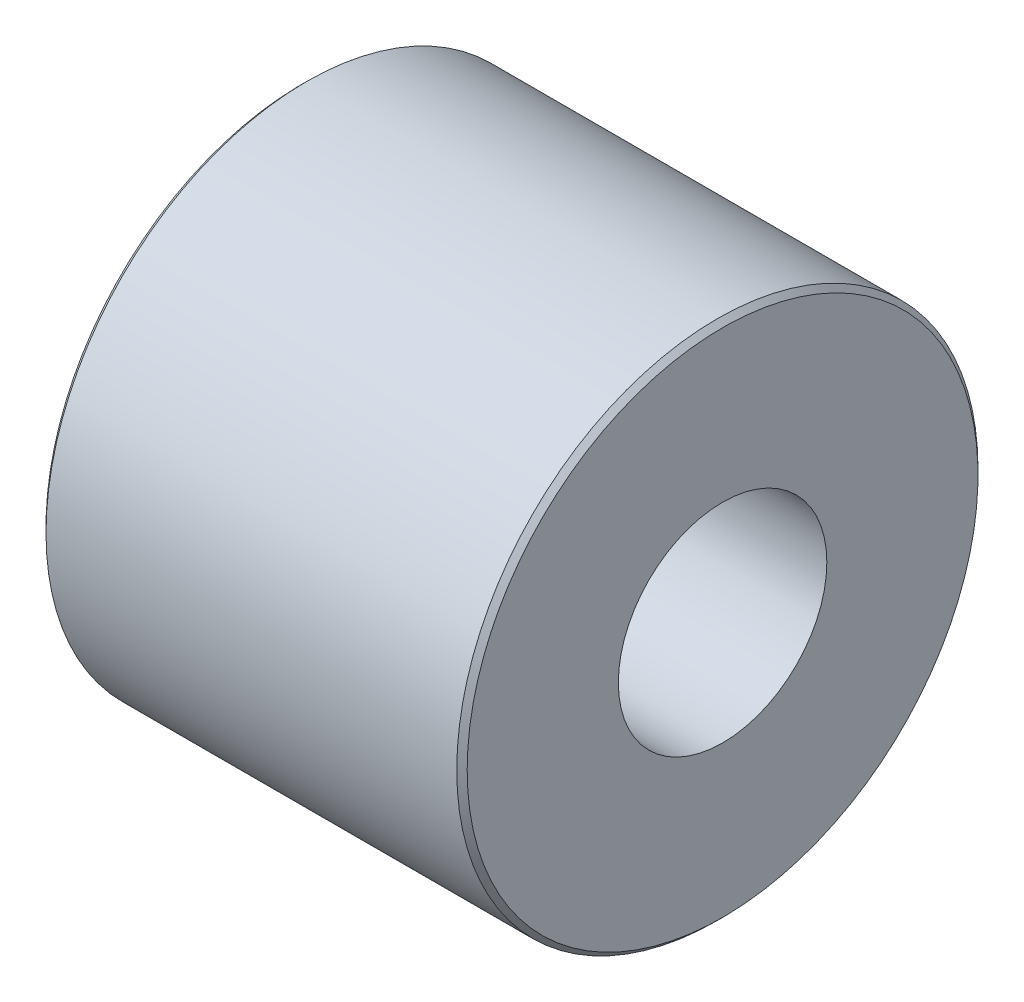
ISO-10303-21;
HEADER;
FILE_DESCRIPTION(('STEP AP214'),'2;1');
FILE_NAME('part.step','',(''),(''),'','','');
FILE_SCHEMA(('AUTOMOTIVE_DESIGN { 1 0 10303 214 1 1 1 1 }'));
ENDSEC;
DATA;
#1=APPLICATION_CONTEXT('core data for automotive mechanical design processes');
#2=APPLICATION_PROTOCOL_DEFINITION('international standard','automotive_design',2000,#1);
#3=PRODUCT_CONTEXT('',#1,'mechanical');
#4=PRODUCT('Part','Part','',(#3));
#5=PRODUCT_RELATED_PRODUCT_CATEGORY('part','',(#4));
#6=PRODUCT_DEFINITION_FORMATION('','',#4);
#7=PRODUCT_DEFINITION_CONTEXT('part definition',#1,'design');
#8=PRODUCT_DEFINITION('design','',#6,#7);
#9=PRODUCT_DEFINITION_SHAPE('','',#8);
#10=(LENGTH_UNIT() NAMED_UNIT(*) SI_UNIT(.MILLI.,.METRE.));
#11=(NAMED_UNIT(*) PLANE_ANGLE_UNIT() SI_UNIT($,.RADIAN.));
#12=(NAMED_UNIT(*) SI_UNIT($,.STERADIAN.) SOLID_ANGLE_UNIT());
#13=UNCERTAINTY_MEASURE_WITH_UNIT(LENGTH_MEASURE(1.E-05),#10,'distance_accuracy_value','');
#14=(GEOMETRIC_REPRESENTATION_CONTEXT(3) GLOBAL_UNCERTAINTY_ASSIGNED_CONTEXT((#13)) GLOBAL_UNIT_ASSIGNED_CONTEXT((#10,
#11,#12)) REPRESENTATION_CONTEXT('',''));
#15=CARTESIAN_POINT('',(0.,0.,0.));
#16=DIRECTION('',(0.,0.,1.));
#17=DIRECTION('',(1.,0.,0.));
#18=AXIS2_PLACEMENT_3D('',#15,#16,#17);
#19=CARTESIAN_POINT('',(4.84,0.,0.));
#20=DIRECTION('',(-1.,0.,0.));
#21=DIRECTION('',(0.,0.,1.));
#22=AXIS2_PLACEMENT_3D('',#19,#20,#21);
#23=CYLINDRICAL_SURFACE('',#22,2.);
#24=CARTESIAN_POINT('',(0.800000000000001,0.,0.));
#25=DIRECTION('',(-1.,0.,0.));
#26=DIRECTION('',(0.,0.,1.));
#27=AXIS2_PLACEMENT_3D('',#24,#25,#26);
#28=CIRCLE('',#27,2.);
#29=CARTESIAN_POINT('',(0.800000000000001,0.,2.));
#30=VERTEX_POINT('',#29);
#31=EDGE_CURVE('E17',#30,#30,#28,.F.);
#32=ORIENTED_EDGE('',*,*,#31,.F.);
#33=EDGE_LOOP('',(#32));
#34=FACE_BOUND('',#33,.T.);
#35=CARTESIAN_POINT('',(8.88,0.,0.));
#36=DIRECTION('',(-1.,0.,0.));
#37=DIRECTION('',(0.,0.,1.));
#38=AXIS2_PLACEMENT_3D('',#35,#36,#37);
#39=CIRCLE('',#38,2.);
#40=CARTESIAN_POINT('',(8.88,0.,2.));
#41=VERTEX_POINT('',#40);
#42=EDGE_CURVE('E35',#41,#41,#39,.T.);
#43=ORIENTED_EDGE('',*,*,#42,.F.);
#44=EDGE_LOOP('',(#43));
#45=FACE_BOUND('',#44,.T.);
#46=ADVANCED_FACE('F14',(#34,#45),#23,.F.);
#47=CARTESIAN_POINT('',(0.800000000000001,3.5,0.));
#48=DIRECTION('',(-1.,0.,0.));
#49=DIRECTION('',(0.,0.,1.));
#50=AXIS2_PLACEMENT_3D('',#47,#48,#49);
#51=PLANE('',#50);
#52=ORIENTED_EDGE('',*,*,#31,.T.);
#53=EDGE_LOOP('',(#52));
#54=FACE_BOUND('',#53,.T.);
#55=CARTESIAN_POINT('',(0.799999999969714,0.,0.));
#56=DIRECTION('',(1.,0.,0.));
#57=DIRECTION('',(0.,0.,-1.));
#58=AXIS2_PLACEMENT_3D('',#55,#56,#57);
#59=CIRCLE('',#58,4.89999999996371);
#60=CARTESIAN_POINT('',(0.799999999969714,0.,-4.89999999996371));
#61=VERTEX_POINT('',#60);
#62=EDGE_CURVE('E33',#61,#61,#59,.T.);
#63=ORIENTED_EDGE('',*,*,#62,.F.);
#64=EDGE_LOOP('',(#63));
#65=FACE_BOUND('',#64,.T.);
#66=ADVANCED_FACE('F42',(#54,#65),#51,.T.);
#67=CARTESIAN_POINT('',(8.88,3.,0.));
#68=DIRECTION('',(1.,0.,0.));
#69=DIRECTION('',(0.,0.,-1.));
#70=AXIS2_PLACEMENT_3D('',#67,#68,#69);
#71=PLANE('',#70);
#72=ORIENTED_EDGE('',*,*,#42,.T.);
#73=EDGE_LOOP('',(#72));
#74=FACE_BOUND('',#73,.T.);
#75=CARTESIAN_POINT('',(8.88000000003331,0.,0.));
#76=DIRECTION('',(-1.,0.,0.));
#77=DIRECTION('',(0.,0.,1.));
#78=AXIS2_PLACEMENT_3D('',#75,#76,#77);
#79=CIRCLE('',#78,4.89999999996371);
#80=CARTESIAN_POINT('',(8.88000000003331,0.,4.89999999996371));
#81=VERTEX_POINT('',#80);
#82=EDGE_CURVE('E26',#81,#81,#79,.T.);
#83=ORIENTED_EDGE('',*,*,#82,.F.);
#84=EDGE_LOOP('',(#83));
#85=FACE_BOUND('',#84,.T.);
#86=ADVANCED_FACE('F51',(#74,#85),#71,.T.);
#87=CARTESIAN_POINT('',(0.900000000001455,0.,0.));
#88=DIRECTION('',(1.,0.,0.));
#89=DIRECTION('',(0.,0.,-1.));
#90=AXIS2_PLACEMENT_3D('',#87,#88,#89);
#91=CONICAL_SURFACE('',#90,4.99999999999545,0.785398163397448);
#92=ORIENTED_EDGE('',*,*,#62,.T.);
#93=EDGE_LOOP('',(#92));
#94=FACE_BOUND('',#93,.T.);
#95=CARTESIAN_POINT('',(0.9,0.,0.));
#96=DIRECTION('',(-1.,0.,0.));
#97=DIRECTION('',(0.,0.,1.));
#98=AXIS2_PLACEMENT_3D('',#95,#96,#97);
#99=CIRCLE('',#98,5.);
#100=CARTESIAN_POINT('',(0.9,0.,5.));
#101=VERTEX_POINT('',#100);
#102=EDGE_CURVE('E21',#101,#101,#99,.F.);
#103=ORIENTED_EDGE('',*,*,#102,.F.);
#104=EDGE_LOOP('',(#103));
#105=FACE_BOUND('',#104,.T.);
#106=ADVANCED_FACE('F60',(#94,#105),#91,.T.);
#107=CARTESIAN_POINT('',(8.78000000000156,0.,0.));
#108=DIRECTION('',(-1.,0.,0.));
#109=DIRECTION('',(0.,0.,1.));
#110=AXIS2_PLACEMENT_3D('',#107,#108,#109);
#111=CONICAL_SURFACE('',#110,4.99999999999545,0.785398163397448);
#112=CARTESIAN_POINT('',(8.78,0.,0.));
#113=DIRECTION('',(-1.,0.,0.));
#114=DIRECTION('',(0.,0.,1.));
#115=AXIS2_PLACEMENT_3D('',#112,#113,#114);
#116=CIRCLE('',#115,5.);
#117=CARTESIAN_POINT('',(8.78,0.,5.));
#118=VERTEX_POINT('',#117);
#119=EDGE_CURVE('E10',#118,#118,#116,.T.);
#120=ORIENTED_EDGE('',*,*,#119,.F.);
#121=EDGE_LOOP('',(#120));
#122=FACE_BOUND('',#121,.T.);
#123=ORIENTED_EDGE('',*,*,#82,.T.);
#124=EDGE_LOOP('',(#123));
#125=FACE_BOUND('',#124,.T.);
#126=ADVANCED_FACE('F54',(#122,#125),#111,.T.);
#127=CARTESIAN_POINT('',(4.84,0.,0.));
#128=DIRECTION('',(-1.,0.,0.));
#129=DIRECTION('',(0.,0.,1.));
#130=AXIS2_PLACEMENT_3D('',#127,#128,#129);
#131=CYLINDRICAL_SURFACE('',#130,5.);
#132=ORIENTED_EDGE('',*,*,#102,.T.);
#133=EDGE_LOOP('',(#132));
#134=FACE_BOUND('',#133,.T.);
#135=ORIENTED_EDGE('',*,*,#119,.T.);
#136=EDGE_LOOP('',(#135));
#137=FACE_BOUND('',#136,.T.);
#138=ADVANCED_FACE('F52',(#134,#137),#131,.T.);
#139=CLOSED_SHELL('',(#46,#66,#86,#106,#126,#138));
#140=MANIFOLD_SOLID_BREP('B1',#139);
#141=ADVANCED_BREP_SHAPE_REPRESENTATION('',(#18,#140),#14);
#142=SHAPE_DEFINITION_REPRESENTATION(#9,#141);
ENDSEC;
END-ISO-10303-21;
